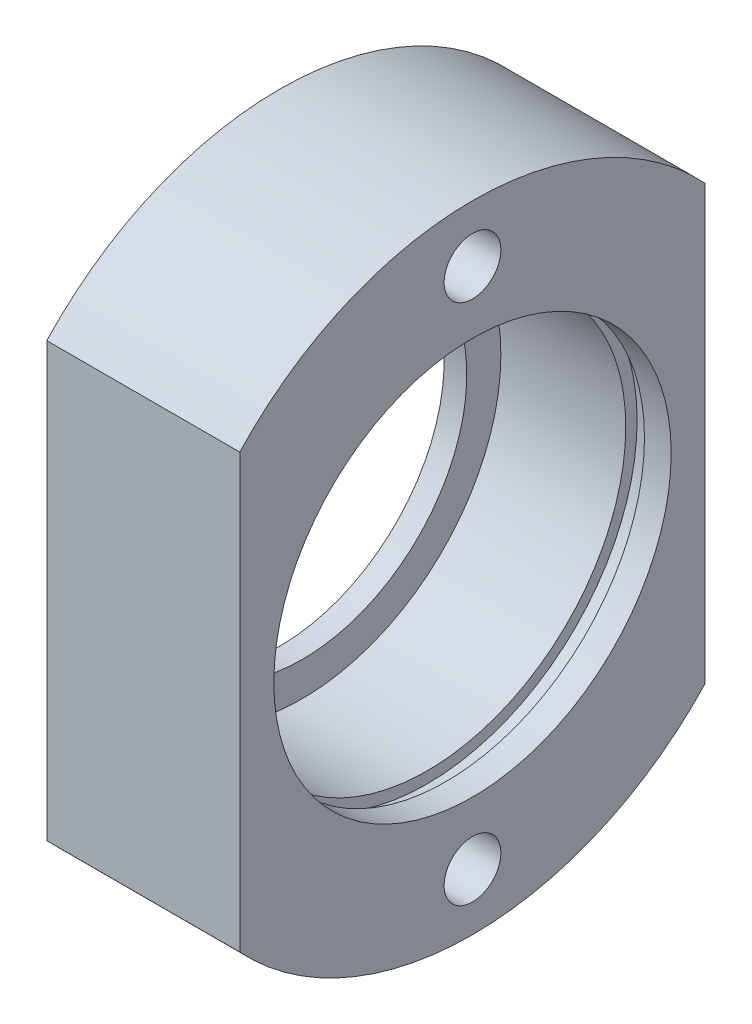
ISO-10303-21;
HEADER;
FILE_DESCRIPTION(('STEP AP214'),'2;1');
FILE_NAME('part.step','',(''),(''),'','','');
FILE_SCHEMA(('AUTOMOTIVE_DESIGN { 1 0 10303 214 1 1 1 1 }'));
ENDSEC;
DATA;
#1=APPLICATION_CONTEXT('core data for automotive mechanical design processes');
#2=APPLICATION_PROTOCOL_DEFINITION('international standard','automotive_design',2000,#1);
#3=PRODUCT_CONTEXT('',#1,'mechanical');
#4=PRODUCT('Part','Part','',(#3));
#5=PRODUCT_RELATED_PRODUCT_CATEGORY('part','',(#4));
#6=PRODUCT_DEFINITION_FORMATION('','',#4);
#7=PRODUCT_DEFINITION_CONTEXT('part definition',#1,'design');
#8=PRODUCT_DEFINITION('design','',#6,#7);
#9=PRODUCT_DEFINITION_SHAPE('','',#8);
#10=(LENGTH_UNIT() NAMED_UNIT(*) SI_UNIT(.MILLI.,.METRE.));
#11=(NAMED_UNIT(*) PLANE_ANGLE_UNIT() SI_UNIT($,.RADIAN.));
#12=(NAMED_UNIT(*) SI_UNIT($,.STERADIAN.) SOLID_ANGLE_UNIT());
#13=UNCERTAINTY_MEASURE_WITH_UNIT(LENGTH_MEASURE(1.E-05),#10,'distance_accuracy_value','');
#14=(GEOMETRIC_REPRESENTATION_CONTEXT(3) GLOBAL_UNCERTAINTY_ASSIGNED_CONTEXT((#13)) GLOBAL_UNIT_ASSIGNED_CONTEXT((#10,
#11,#12)) REPRESENTATION_CONTEXT('',''));
#15=CARTESIAN_POINT('',(0.,0.,0.));
#16=DIRECTION('',(0.,0.,1.));
#17=DIRECTION('',(1.,0.,0.));
#18=AXIS2_PLACEMENT_3D('',#15,#16,#17);
#19=CARTESIAN_POINT('',(0.,0.,0.));
#20=DIRECTION('',(-1.,0.,0.));
#21=DIRECTION('',(0.,0.,1.));
#22=AXIS2_PLACEMENT_3D('',#19,#20,#21);
#23=CYLINDRICAL_SURFACE('',#22,28.);
#24=CARTESIAN_POINT('',(17.,0.,0.));
#25=DIRECTION('',(-1.,0.,0.));
#26=DIRECTION('',(0.,0.,1.));
#27=AXIS2_PLACEMENT_3D('',#24,#25,#26);
#28=CIRCLE('',#27,28.);
#29=CARTESIAN_POINT('',(17.,19.0722311227606,20.5));
#30=VERTEX_POINT('',#29);
#31=CARTESIAN_POINT('',(17.,19.0722311227606,-20.5));
#32=VERTEX_POINT('',#31);
#33=EDGE_CURVE('E90',#30,#32,#28,.T.);
#34=ORIENTED_EDGE('',*,*,#33,.T.);
#35=DIRECTION('',(1.,0.,0.));
#36=VECTOR('',#35,1.);
#37=CARTESIAN_POINT('',(0.,19.0722311227606,-20.5));
#38=LINE('',#37,#36);
#39=CARTESIAN_POINT('',(0.,19.0722311227606,-20.5));
#40=VERTEX_POINT('',#39);
#41=EDGE_CURVE('E52',#40,#32,#38,.T.);
#42=ORIENTED_EDGE('',*,*,#41,.F.);
#43=CARTESIAN_POINT('',(0.,0.,0.));
#44=DIRECTION('',(-1.,0.,0.));
#45=DIRECTION('',(0.,0.,1.));
#46=AXIS2_PLACEMENT_3D('',#43,#44,#45);
#47=CIRCLE('',#46,28.);
#48=CARTESIAN_POINT('',(0.,19.0722311227606,20.5));
#49=VERTEX_POINT('',#48);
#50=EDGE_CURVE('E11',#49,#40,#47,.T.);
#51=ORIENTED_EDGE('',*,*,#50,.F.);
#52=DIRECTION('',(1.,0.,0.));
#53=VECTOR('',#52,1.);
#54=CARTESIAN_POINT('',(0.,19.0722311227606,20.5));
#55=LINE('',#54,#53);
#56=EDGE_CURVE('E99',#49,#30,#55,.T.);
#57=ORIENTED_EDGE('',*,*,#56,.T.);
#58=EDGE_LOOP('',(#34,#42,#51,#57));
#59=FACE_BOUND('',#58,.T.);
#60=ADVANCED_FACE('F37',(#59),#23,.T.);
#61=CARTESIAN_POINT('',(0.,14.5,0.));
#62=DIRECTION('',(1.,0.,0.));
#63=DIRECTION('',(0.,0.,-1.));
#64=AXIS2_PLACEMENT_3D('',#61,#62,#63);
#65=PLANE('',#64);
#66=CARTESIAN_POINT('',(0.,23.,0.));
#67=DIRECTION('',(1.,0.,0.));
#68=DIRECTION('',(0.,0.,-1.));
#69=AXIS2_PLACEMENT_3D('',#66,#67,#68);
#70=CIRCLE('',#69,2.5);
#71=CARTESIAN_POINT('',(0.,23.,-2.49999999999999));
#72=VERTEX_POINT('',#71);
#73=EDGE_CURVE('E185',#72,#72,#70,.T.);
#74=ORIENTED_EDGE('',*,*,#73,.T.);
#75=EDGE_LOOP('',(#74));
#76=FACE_BOUND('',#75,.T.);
#77=CARTESIAN_POINT('',(0.,-23.,0.));
#78=DIRECTION('',(1.,0.,0.));
#79=DIRECTION('',(0.,0.,-1.));
#80=AXIS2_PLACEMENT_3D('',#77,#78,#79);
#81=CIRCLE('',#80,2.5);
#82=CARTESIAN_POINT('',(0.,-23.,-2.49999999999999));
#83=VERTEX_POINT('',#82);
#84=EDGE_CURVE('E188',#83,#83,#81,.T.);
#85=ORIENTED_EDGE('',*,*,#84,.T.);
#86=EDGE_LOOP('',(#85));
#87=FACE_BOUND('',#86,.T.);
#88=CARTESIAN_POINT('',(0.,0.,0.));
#89=DIRECTION('',(-1.,0.,0.));
#90=DIRECTION('',(0.,0.,1.));
#91=AXIS2_PLACEMENT_3D('',#88,#89,#90);
#92=CIRCLE('',#91,14.5);
#93=CARTESIAN_POINT('',(0.,0.,14.5));
#94=VERTEX_POINT('',#93);
#95=EDGE_CURVE('E104',#94,#94,#92,.T.);
#96=ORIENTED_EDGE('',*,*,#95,.F.);
#97=EDGE_LOOP('',(#96));
#98=FACE_BOUND('',#97,.T.);
#99=ORIENTED_EDGE('',*,*,#50,.T.);
#100=DIRECTION('',(0.,-1.,0.));
#101=VECTOR('',#100,1.);
#102=CARTESIAN_POINT('',(0.,19.0722311227606,-20.5));
#103=LINE('',#102,#101);
#104=CARTESIAN_POINT('',(0.,-19.0722311227606,-20.5));
#105=VERTEX_POINT('',#104);
#106=EDGE_CURVE('E78',#40,#105,#103,.T.);
#107=ORIENTED_EDGE('',*,*,#106,.T.);
#108=CARTESIAN_POINT('',(0.,-19.0722311227606,20.5));
#109=VERTEX_POINT('',#108);
#110=EDGE_CURVE('E45',#105,#109,#47,.T.);
#111=ORIENTED_EDGE('',*,*,#110,.T.);
#112=DIRECTION('',(0.,1.,0.));
#113=VECTOR('',#112,1.);
#114=CARTESIAN_POINT('',(0.,19.0722311227606,20.5));
#115=LINE('',#114,#113);
#116=EDGE_CURVE('E94',#109,#49,#115,.T.);
#117=ORIENTED_EDGE('',*,*,#116,.T.);
#118=EDGE_LOOP('',(#99,#107,#111,#117));
#119=FACE_BOUND('',#118,.T.);
#120=ADVANCED_FACE('F39',(#76,#87,#98,#119),#65,.F.);
#121=ORIENTED_EDGE('',*,*,#110,.F.);
#122=DIRECTION('',(1.,0.,0.));
#123=VECTOR('',#122,1.);
#124=CARTESIAN_POINT('',(0.,-19.0722311227606,-20.5));
#125=LINE('',#124,#123);
#126=CARTESIAN_POINT('',(17.,-19.0722311227606,-20.5));
#127=VERTEX_POINT('',#126);
#128=EDGE_CURVE('E80',#105,#127,#125,.T.);
#129=ORIENTED_EDGE('',*,*,#128,.T.);
#130=CARTESIAN_POINT('',(17.,-19.0722311227606,20.5));
#131=VERTEX_POINT('',#130);
#132=EDGE_CURVE('E60',#127,#131,#28,.T.);
#133=ORIENTED_EDGE('',*,*,#132,.T.);
#134=DIRECTION('',(1.,0.,0.));
#135=VECTOR('',#134,1.);
#136=CARTESIAN_POINT('',(0.,-19.0722311227606,20.5));
#137=LINE('',#136,#135);
#138=EDGE_CURVE('E96',#109,#131,#137,.T.);
#139=ORIENTED_EDGE('',*,*,#138,.F.);
#140=EDGE_LOOP('',(#121,#129,#133,#139));
#141=FACE_BOUND('',#140,.T.);
#142=ADVANCED_FACE('F176',(#141),#23,.T.);
#143=CARTESIAN_POINT('',(17.,28.,0.));
#144=DIRECTION('',(-1.,0.,0.));
#145=DIRECTION('',(0.,0.,1.));
#146=AXIS2_PLACEMENT_3D('',#143,#144,#145);
#147=PLANE('',#146);
#148=CARTESIAN_POINT('',(17.,23.,0.));
#149=DIRECTION('',(1.,0.,0.));
#150=DIRECTION('',(0.,0.,-1.));
#151=AXIS2_PLACEMENT_3D('',#148,#149,#150);
#152=CIRCLE('',#151,2.5);
#153=CARTESIAN_POINT('',(17.,23.,-2.5));
#154=VERTEX_POINT('',#153);
#155=EDGE_CURVE('E214',#154,#154,#152,.T.);
#156=ORIENTED_EDGE('',*,*,#155,.F.);
#157=EDGE_LOOP('',(#156));
#158=FACE_BOUND('',#157,.T.);
#159=CARTESIAN_POINT('',(17.,-23.,0.));
#160=DIRECTION('',(1.,0.,0.));
#161=DIRECTION('',(0.,0.,-1.));
#162=AXIS2_PLACEMENT_3D('',#159,#160,#161);
#163=CIRCLE('',#162,2.5);
#164=CARTESIAN_POINT('',(17.,-23.,-2.5));
#165=VERTEX_POINT('',#164);
#166=EDGE_CURVE('E190',#165,#165,#163,.T.);
#167=ORIENTED_EDGE('',*,*,#166,.F.);
#168=EDGE_LOOP('',(#167));
#169=FACE_BOUND('',#168,.T.);
#170=ORIENTED_EDGE('',*,*,#132,.F.);
#171=DIRECTION('',(0.,-1.,0.));
#172=VECTOR('',#171,1.);
#173=CARTESIAN_POINT('',(17.,19.0722311227606,-20.5));
#174=LINE('',#173,#172);
#175=EDGE_CURVE('E83',#32,#127,#174,.T.);
#176=ORIENTED_EDGE('',*,*,#175,.F.);
#177=ORIENTED_EDGE('',*,*,#33,.F.);
#178=DIRECTION('',(0.,1.,0.));
#179=VECTOR('',#178,1.);
#180=CARTESIAN_POINT('',(17.,19.0722311227606,20.5));
#181=LINE('',#180,#179);
#182=EDGE_CURVE('E97',#131,#30,#181,.T.);
#183=ORIENTED_EDGE('',*,*,#182,.F.);
#184=EDGE_LOOP('',(#170,#176,#177,#183));
#185=FACE_BOUND('',#184,.T.);
#186=CARTESIAN_POINT('',(17.,0.,0.));
#187=DIRECTION('',(-1.,0.,0.));
#188=DIRECTION('',(0.,0.,1.));
#189=AXIS2_PLACEMENT_3D('',#186,#187,#188);
#190=CIRCLE('',#189,17.5);
#191=CARTESIAN_POINT('',(17.,0.,17.5));
#192=VERTEX_POINT('',#191);
#193=EDGE_CURVE('E126',#192,#192,#190,.T.);
#194=ORIENTED_EDGE('',*,*,#193,.T.);
#195=EDGE_LOOP('',(#194));
#196=FACE_BOUND('',#195,.T.);
#197=ADVANCED_FACE('F130',(#158,#169,#185,#196),#147,.F.);
#198=CARTESIAN_POINT('',(0.,0.,0.));
#199=DIRECTION('',(-1.,0.,0.));
#200=DIRECTION('',(0.,0.,1.));
#201=AXIS2_PLACEMENT_3D('',#198,#199,#200);
#202=CYLINDRICAL_SURFACE('',#201,17.5);
#203=ORIENTED_EDGE('',*,*,#193,.F.);
#204=EDGE_LOOP('',(#203));
#205=FACE_BOUND('',#204,.T.);
#206=CARTESIAN_POINT('',(14.65,0.,0.));
#207=DIRECTION('',(-1.,0.,0.));
#208=DIRECTION('',(0.,0.,1.));
#209=AXIS2_PLACEMENT_3D('',#206,#207,#208);
#210=CIRCLE('',#209,17.5);
#211=CARTESIAN_POINT('',(14.65,0.,17.5));
#212=VERTEX_POINT('',#211);
#213=EDGE_CURVE('E123',#212,#212,#210,.T.);
#214=ORIENTED_EDGE('',*,*,#213,.T.);
#215=EDGE_LOOP('',(#214));
#216=FACE_BOUND('',#215,.T.);
#217=ADVANCED_FACE('F132',(#205,#216),#202,.F.);
#218=CARTESIAN_POINT('',(14.65,17.5,0.));
#219=DIRECTION('',(1.,0.,0.));
#220=DIRECTION('',(0.,0.,-1.));
#221=AXIS2_PLACEMENT_3D('',#218,#219,#220);
#222=PLANE('',#221);
#223=ORIENTED_EDGE('',*,*,#213,.F.);
#224=EDGE_LOOP('',(#223));
#225=FACE_BOUND('',#224,.T.);
#226=CARTESIAN_POINT('',(14.65,0.,0.));
#227=DIRECTION('',(-1.,0.,0.));
#228=DIRECTION('',(0.,0.,1.));
#229=AXIS2_PLACEMENT_3D('',#226,#227,#228);
#230=CIRCLE('',#229,18.5);
#231=CARTESIAN_POINT('',(14.65,0.,18.5));
#232=VERTEX_POINT('',#231);
#233=EDGE_CURVE('E120',#232,#232,#230,.T.);
#234=ORIENTED_EDGE('',*,*,#233,.T.);
#235=EDGE_LOOP('',(#234));
#236=FACE_BOUND('',#235,.T.);
#237=ADVANCED_FACE('F135',(#225,#236),#222,.F.);
#238=CARTESIAN_POINT('',(0.,0.,0.));
#239=DIRECTION('',(-1.,0.,0.));
#240=DIRECTION('',(0.,0.,1.));
#241=AXIS2_PLACEMENT_3D('',#238,#239,#240);
#242=CYLINDRICAL_SURFACE('',#241,18.5);
#243=ORIENTED_EDGE('',*,*,#233,.F.);
#244=EDGE_LOOP('',(#243));
#245=FACE_BOUND('',#244,.T.);
#246=CARTESIAN_POINT('',(13.,0.,0.));
#247=DIRECTION('',(-1.,0.,0.));
#248=DIRECTION('',(0.,0.,1.));
#249=AXIS2_PLACEMENT_3D('',#246,#247,#248);
#250=CIRCLE('',#249,18.5);
#251=CARTESIAN_POINT('',(13.,0.,18.5));
#252=VERTEX_POINT('',#251);
#253=EDGE_CURVE('E117',#252,#252,#250,.T.);
#254=ORIENTED_EDGE('',*,*,#253,.T.);
#255=EDGE_LOOP('',(#254));
#256=FACE_BOUND('',#255,.T.);
#257=ADVANCED_FACE('F141',(#245,#256),#242,.F.);
#258=CARTESIAN_POINT('',(13.,18.5,0.));
#259=DIRECTION('',(-1.,0.,0.));
#260=DIRECTION('',(0.,0.,1.));
#261=AXIS2_PLACEMENT_3D('',#258,#259,#260);
#262=PLANE('',#261);
#263=ORIENTED_EDGE('',*,*,#253,.F.);
#264=EDGE_LOOP('',(#263));
#265=FACE_BOUND('',#264,.T.);
#266=CARTESIAN_POINT('',(13.,0.,0.));
#267=DIRECTION('',(-1.,0.,0.));
#268=DIRECTION('',(0.,0.,1.));
#269=AXIS2_PLACEMENT_3D('',#266,#267,#268);
#270=CIRCLE('',#269,17.5);
#271=CARTESIAN_POINT('',(13.,0.,17.5));
#272=VERTEX_POINT('',#271);
#273=EDGE_CURVE('E114',#272,#272,#270,.T.);
#274=ORIENTED_EDGE('',*,*,#273,.T.);
#275=EDGE_LOOP('',(#274));
#276=FACE_BOUND('',#275,.T.);
#277=ADVANCED_FACE('F147',(#265,#276),#262,.F.);
#278=CARTESIAN_POINT('',(0.,0.,0.));
#279=DIRECTION('',(-1.,0.,0.));
#280=DIRECTION('',(0.,0.,1.));
#281=AXIS2_PLACEMENT_3D('',#278,#279,#280);
#282=CYLINDRICAL_SURFACE('',#281,17.5);
#283=ORIENTED_EDGE('',*,*,#273,.F.);
#284=EDGE_LOOP('',(#283));
#285=FACE_BOUND('',#284,.T.);
#286=CARTESIAN_POINT('',(2.,0.,0.));
#287=DIRECTION('',(-1.,0.,0.));
#288=DIRECTION('',(0.,0.,1.));
#289=AXIS2_PLACEMENT_3D('',#286,#287,#288);
#290=CIRCLE('',#289,17.5);
#291=CARTESIAN_POINT('',(2.,0.,17.5));
#292=VERTEX_POINT('',#291);
#293=EDGE_CURVE('E111',#292,#292,#290,.T.);
#294=ORIENTED_EDGE('',*,*,#293,.T.);
#295=EDGE_LOOP('',(#294));
#296=FACE_BOUND('',#295,.T.);
#297=ADVANCED_FACE('F153',(#285,#296),#282,.F.);
#298=CARTESIAN_POINT('',(2.,17.5,0.));
#299=DIRECTION('',(-1.,0.,0.));
#300=DIRECTION('',(0.,0.,1.));
#301=AXIS2_PLACEMENT_3D('',#298,#299,#300);
#302=PLANE('',#301);
#303=ORIENTED_EDGE('',*,*,#293,.F.);
#304=EDGE_LOOP('',(#303));
#305=FACE_BOUND('',#304,.T.);
#306=CARTESIAN_POINT('',(2.,0.,0.));
#307=DIRECTION('',(-1.,0.,0.));
#308=DIRECTION('',(0.,0.,1.));
#309=AXIS2_PLACEMENT_3D('',#306,#307,#308);
#310=CIRCLE('',#309,14.5);
#311=CARTESIAN_POINT('',(2.,0.,14.5));
#312=VERTEX_POINT('',#311);
#313=EDGE_CURVE('E108',#312,#312,#310,.T.);
#314=ORIENTED_EDGE('',*,*,#313,.T.);
#315=EDGE_LOOP('',(#314));
#316=FACE_BOUND('',#315,.T.);
#317=ADVANCED_FACE('F159',(#305,#316),#302,.F.);
#318=CARTESIAN_POINT('',(0.,0.,0.));
#319=DIRECTION('',(-1.,0.,0.));
#320=DIRECTION('',(0.,0.,1.));
#321=AXIS2_PLACEMENT_3D('',#318,#319,#320);
#322=CYLINDRICAL_SURFACE('',#321,14.5);
#323=ORIENTED_EDGE('',*,*,#313,.F.);
#324=EDGE_LOOP('',(#323));
#325=FACE_BOUND('',#324,.T.);
#326=ORIENTED_EDGE('',*,*,#95,.T.);
#327=EDGE_LOOP('',(#326));
#328=FACE_BOUND('',#327,.T.);
#329=ADVANCED_FACE('F165',(#325,#328),#322,.F.);
#330=CARTESIAN_POINT('',(0.,19.0722311227606,20.5));
#331=DIRECTION('',(0.,0.,-1.));
#332=DIRECTION('',(-1.,0.,0.));
#333=AXIS2_PLACEMENT_3D('',#330,#331,#332);
#334=PLANE('',#333);
#335=ORIENTED_EDGE('',*,*,#182,.T.);
#336=ORIENTED_EDGE('',*,*,#56,.F.);
#337=ORIENTED_EDGE('',*,*,#116,.F.);
#338=ORIENTED_EDGE('',*,*,#138,.T.);
#339=EDGE_LOOP('',(#335,#336,#337,#338));
#340=FACE_BOUND('',#339,.T.);
#341=ADVANCED_FACE('F171',(#340),#334,.F.);
#342=CARTESIAN_POINT('',(0.,19.0722311227606,-20.5));
#343=DIRECTION('',(0.,0.,1.));
#344=DIRECTION('',(1.,0.,0.));
#345=AXIS2_PLACEMENT_3D('',#342,#343,#344);
#346=PLANE('',#345);
#347=ORIENTED_EDGE('',*,*,#175,.T.);
#348=ORIENTED_EDGE('',*,*,#128,.F.);
#349=ORIENTED_EDGE('',*,*,#106,.F.);
#350=ORIENTED_EDGE('',*,*,#41,.T.);
#351=EDGE_LOOP('',(#347,#348,#349,#350));
#352=FACE_BOUND('',#351,.T.);
#353=ADVANCED_FACE('F79',(#352),#346,.F.);
#354=CARTESIAN_POINT('',(17.,-23.,0.));
#355=DIRECTION('',(1.,0.,0.));
#356=DIRECTION('',(0.,0.,-1.));
#357=AXIS2_PLACEMENT_3D('',#354,#355,#356);
#358=CYLINDRICAL_SURFACE('',#357,2.5);
#359=ORIENTED_EDGE('',*,*,#84,.F.);
#360=EDGE_LOOP('',(#359));
#361=FACE_BOUND('',#360,.T.);
#362=ORIENTED_EDGE('',*,*,#166,.T.);
#363=EDGE_LOOP('',(#362));
#364=FACE_BOUND('',#363,.T.);
#365=ADVANCED_FACE('F203',(#361,#364),#358,.F.);
#366=CARTESIAN_POINT('',(17.,23.,0.));
#367=DIRECTION('',(1.,0.,0.));
#368=DIRECTION('',(0.,0.,-1.));
#369=AXIS2_PLACEMENT_3D('',#366,#367,#368);
#370=CYLINDRICAL_SURFACE('',#369,2.5);
#371=ORIENTED_EDGE('',*,*,#73,.F.);
#372=EDGE_LOOP('',(#371));
#373=FACE_BOUND('',#372,.T.);
#374=ORIENTED_EDGE('',*,*,#155,.T.);
#375=EDGE_LOOP('',(#374));
#376=FACE_BOUND('',#375,.T.);
#377=ADVANCED_FACE('F218',(#373,#376),#370,.F.);
#378=CLOSED_SHELL('',(#60,#120,#142,#197,#217,#237,#257,#277,#297,#317,#329,#341,#353,#365,#377));
#379=MANIFOLD_SOLID_BREP('B2',#378);
#380=ADVANCED_BREP_SHAPE_REPRESENTATION('',(#18,#379),#14);
#381=SHAPE_DEFINITION_REPRESENTATION(#9,#380);
ENDSEC;
END-ISO-10303-21;
